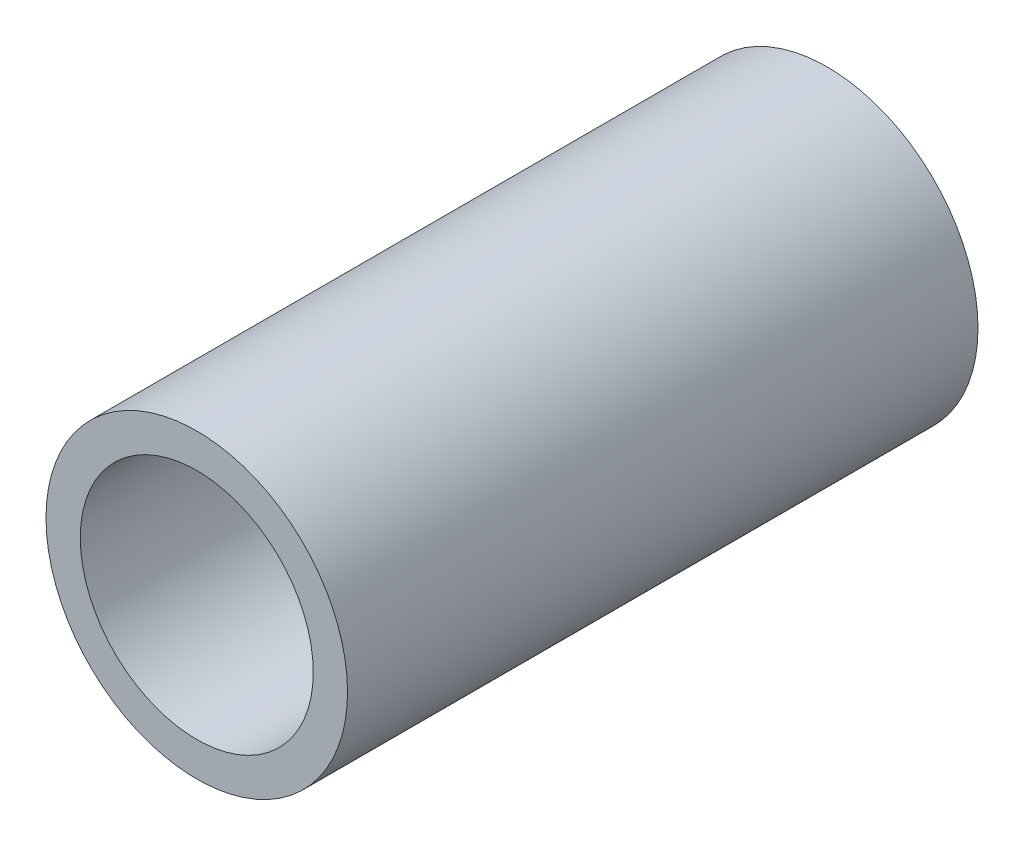
ISO-10303-21;
HEADER;
FILE_DESCRIPTION(('STEP AP214'),'2;1');
FILE_NAME('part.step','',(''),(''),'','','');
FILE_SCHEMA(('AUTOMOTIVE_DESIGN { 1 0 10303 214 1 1 1 1 }'));
ENDSEC;
DATA;
#1=APPLICATION_CONTEXT('core data for automotive mechanical design processes');
#2=APPLICATION_PROTOCOL_DEFINITION('international standard','automotive_design',2000,#1);
#3=PRODUCT_CONTEXT('',#1,'mechanical');
#4=PRODUCT('Part','Part','',(#3));
#5=PRODUCT_RELATED_PRODUCT_CATEGORY('part','',(#4));
#6=PRODUCT_DEFINITION_FORMATION('','',#4);
#7=PRODUCT_DEFINITION_CONTEXT('part definition',#1,'design');
#8=PRODUCT_DEFINITION('design','',#6,#7);
#9=PRODUCT_DEFINITION_SHAPE('','',#8);
#10=(LENGTH_UNIT() NAMED_UNIT(*) SI_UNIT(.MILLI.,.METRE.));
#11=(NAMED_UNIT(*) PLANE_ANGLE_UNIT() SI_UNIT($,.RADIAN.));
#12=(NAMED_UNIT(*) SI_UNIT($,.STERADIAN.) SOLID_ANGLE_UNIT());
#13=UNCERTAINTY_MEASURE_WITH_UNIT(LENGTH_MEASURE(1.E-05),#10,'distance_accuracy_value','');
#14=(GEOMETRIC_REPRESENTATION_CONTEXT(3) GLOBAL_UNCERTAINTY_ASSIGNED_CONTEXT((#13)) GLOBAL_UNIT_ASSIGNED_CONTEXT((#10,
#11,#12)) REPRESENTATION_CONTEXT('',''));
#15=CARTESIAN_POINT('',(0.,0.,0.));
#16=DIRECTION('',(0.,0.,1.));
#17=DIRECTION('',(1.,0.,0.));
#18=AXIS2_PLACEMENT_3D('',#15,#16,#17);
#19=CARTESIAN_POINT('',(0.,0.,23.));
#20=DIRECTION('',(0.,0.,1.));
#21=DIRECTION('',(1.,0.,0.));
#22=AXIS2_PLACEMENT_3D('',#19,#20,#21);
#23=PLANE('',#22);
#24=CARTESIAN_POINT('',(0.,0.,23.));
#25=DIRECTION('',(0.,0.,1.));
#26=DIRECTION('',(1.,0.,0.));
#27=AXIS2_PLACEMENT_3D('',#24,#25,#26);
#28=CIRCLE('',#27,5.5);
#29=CARTESIAN_POINT('',(5.5,0.,23.));
#30=VERTEX_POINT('',#29);
#31=EDGE_CURVE('E10',#30,#30,#28,.T.);
#32=ORIENTED_EDGE('',*,*,#31,.T.);
#33=EDGE_LOOP('',(#32));
#34=FACE_BOUND('',#33,.T.);
#35=CARTESIAN_POINT('',(0.,0.,23.));
#36=DIRECTION('',(0.,0.,1.));
#37=DIRECTION('',(1.,0.,0.));
#38=AXIS2_PLACEMENT_3D('',#35,#36,#37);
#39=CIRCLE('',#38,4.25);
#40=CARTESIAN_POINT('',(4.25,0.,23.));
#41=VERTEX_POINT('',#40);
#42=EDGE_CURVE('E43',#41,#41,#39,.T.);
#43=ORIENTED_EDGE('',*,*,#42,.F.);
#44=EDGE_LOOP('',(#43));
#45=FACE_BOUND('',#44,.T.);
#46=ADVANCED_FACE('F32',(#34,#45),#23,.T.);
#47=CARTESIAN_POINT('',(0.,0.,0.));
#48=DIRECTION('',(0.,0.,1.));
#49=DIRECTION('',(1.,0.,0.));
#50=AXIS2_PLACEMENT_3D('',#47,#48,#49);
#51=PLANE('',#50);
#52=CARTESIAN_POINT('',(0.,0.,0.));
#53=DIRECTION('',(0.,0.,1.));
#54=DIRECTION('',(1.,0.,0.));
#55=AXIS2_PLACEMENT_3D('',#52,#53,#54);
#56=CIRCLE('',#55,5.5);
#57=CARTESIAN_POINT('',(5.5,0.,0.));
#58=VERTEX_POINT('',#57);
#59=EDGE_CURVE('E36',#58,#58,#56,.T.);
#60=ORIENTED_EDGE('',*,*,#59,.F.);
#61=EDGE_LOOP('',(#60));
#62=FACE_BOUND('',#61,.T.);
#63=CARTESIAN_POINT('',(0.,0.,0.));
#64=DIRECTION('',(0.,0.,1.));
#65=DIRECTION('',(1.,0.,0.));
#66=AXIS2_PLACEMENT_3D('',#63,#64,#65);
#67=CIRCLE('',#66,4.25);
#68=CARTESIAN_POINT('',(4.25,0.,0.));
#69=VERTEX_POINT('',#68);
#70=EDGE_CURVE('E45',#69,#69,#67,.T.);
#71=ORIENTED_EDGE('',*,*,#70,.T.);
#72=EDGE_LOOP('',(#71));
#73=FACE_BOUND('',#72,.T.);
#74=ADVANCED_FACE('F55',(#62,#73),#51,.F.);
#75=CARTESIAN_POINT('',(0.,0.,23.));
#76=DIRECTION('',(0.,0.,-1.));
#77=DIRECTION('',(-1.,0.,0.));
#78=AXIS2_PLACEMENT_3D('',#75,#76,#77);
#79=CYLINDRICAL_SURFACE('',#78,5.5);
#80=ORIENTED_EDGE('',*,*,#31,.F.);
#81=EDGE_LOOP('',(#80));
#82=FACE_BOUND('',#81,.T.);
#83=ORIENTED_EDGE('',*,*,#59,.T.);
#84=EDGE_LOOP('',(#83));
#85=FACE_BOUND('',#84,.T.);
#86=ADVANCED_FACE('F34',(#82,#85),#79,.T.);
#87=CARTESIAN_POINT('',(0.,0.,23.));
#88=DIRECTION('',(0.,0.,-1.));
#89=DIRECTION('',(-1.,0.,0.));
#90=AXIS2_PLACEMENT_3D('',#87,#88,#89);
#91=CYLINDRICAL_SURFACE('',#90,4.25);
#92=ORIENTED_EDGE('',*,*,#42,.T.);
#93=EDGE_LOOP('',(#92));
#94=FACE_BOUND('',#93,.T.);
#95=ORIENTED_EDGE('',*,*,#70,.F.);
#96=EDGE_LOOP('',(#95));
#97=FACE_BOUND('',#96,.T.);
#98=ADVANCED_FACE('F51',(#94,#97),#91,.F.);
#99=CLOSED_SHELL('',(#46,#74,#86,#98));
#100=MANIFOLD_SOLID_BREP('B2',#99);
#101=ADVANCED_BREP_SHAPE_REPRESENTATION('',(#18,#100),#14);
#102=SHAPE_DEFINITION_REPRESENTATION(#9,#101);
ENDSEC;
END-ISO-10303-21;
